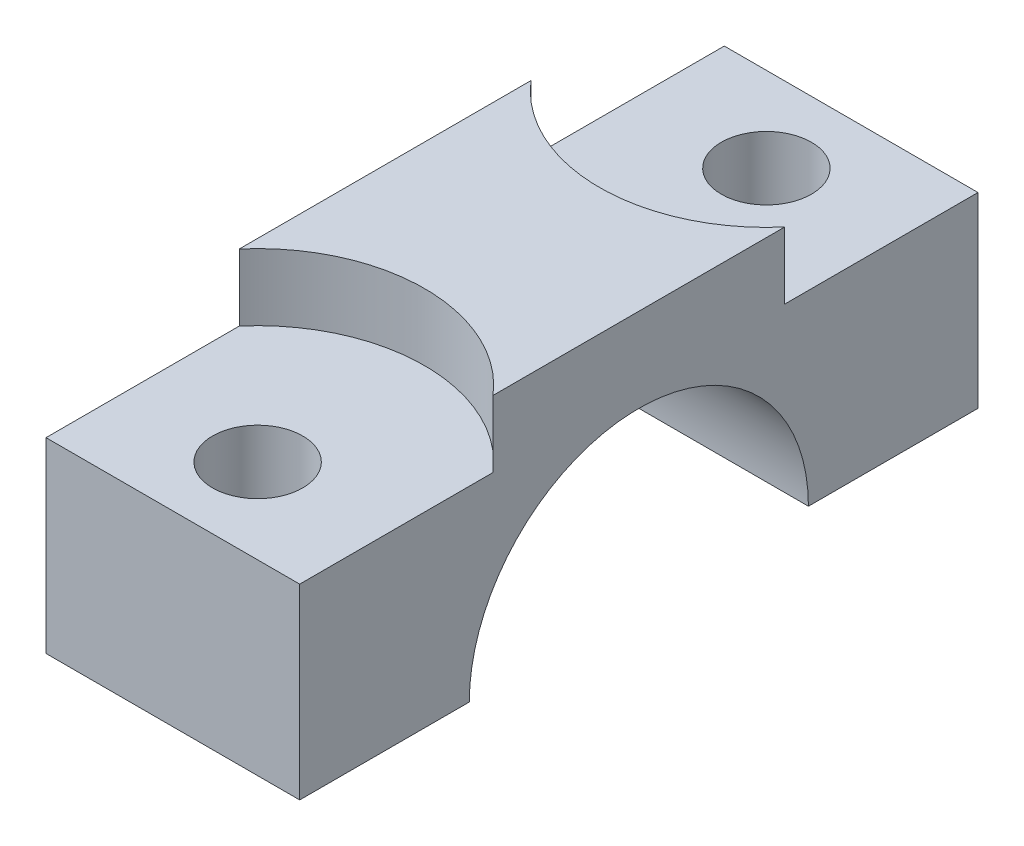
ISO-10303-21;
HEADER;
FILE_DESCRIPTION(('STEP AP214'),'2;1');
FILE_NAME('part.step','',(''),(''),'','','');
FILE_SCHEMA(('AUTOMOTIVE_DESIGN { 1 0 10303 214 1 1 1 1 }'));
ENDSEC;
DATA;
#1=APPLICATION_CONTEXT('core data for automotive mechanical design processes');
#2=APPLICATION_PROTOCOL_DEFINITION('international standard','automotive_design',2000,#1);
#3=PRODUCT_CONTEXT('',#1,'mechanical');
#4=PRODUCT('Part','Part','',(#3));
#5=PRODUCT_RELATED_PRODUCT_CATEGORY('part','',(#4));
#6=PRODUCT_DEFINITION_FORMATION('','',#4);
#7=PRODUCT_DEFINITION_CONTEXT('part definition',#1,'design');
#8=PRODUCT_DEFINITION('design','',#6,#7);
#9=PRODUCT_DEFINITION_SHAPE('','',#8);
#10=(LENGTH_UNIT() NAMED_UNIT(*) SI_UNIT(.MILLI.,.METRE.));
#11=(NAMED_UNIT(*) PLANE_ANGLE_UNIT() SI_UNIT($,.RADIAN.));
#12=(NAMED_UNIT(*) SI_UNIT($,.STERADIAN.) SOLID_ANGLE_UNIT());
#13=UNCERTAINTY_MEASURE_WITH_UNIT(LENGTH_MEASURE(1.E-05),#10,'distance_accuracy_value','');
#14=(GEOMETRIC_REPRESENTATION_CONTEXT(3) GLOBAL_UNCERTAINTY_ASSIGNED_CONTEXT((#13)) GLOBAL_UNIT_ASSIGNED_CONTEXT((#10,
#11,#12)) REPRESENTATION_CONTEXT('',''));
#15=CARTESIAN_POINT('',(0.,0.,0.));
#16=DIRECTION('',(0.,0.,1.));
#17=DIRECTION('',(1.,0.,0.));
#18=AXIS2_PLACEMENT_3D('',#15,#16,#17);
#19=CARTESIAN_POINT('',(9.5,0.,0.));
#20=DIRECTION('',(-1.,0.,0.));
#21=DIRECTION('',(0.,0.,1.));
#22=AXIS2_PLACEMENT_3D('',#19,#20,#21);
#23=CYLINDRICAL_SURFACE('',#22,12.7);
#24=CARTESIAN_POINT('',(-9.5,0.,0.));
#25=DIRECTION('',(1.,0.,0.));
#26=DIRECTION('',(0.,0.,-1.));
#27=AXIS2_PLACEMENT_3D('',#24,#25,#26);
#28=CIRCLE('',#27,12.7);
#29=CARTESIAN_POINT('',(-9.5,0.,-12.7));
#30=VERTEX_POINT('',#29);
#31=CARTESIAN_POINT('',(-9.5,0.,12.7));
#32=VERTEX_POINT('',#31);
#33=EDGE_CURVE('E144',#30,#32,#28,.T.);
#34=ORIENTED_EDGE('',*,*,#33,.F.);
#35=DIRECTION('',(-1.,0.,0.));
#36=VECTOR('',#35,1.);
#37=CARTESIAN_POINT('',(9.5,0.,-12.7));
#38=LINE('',#37,#36);
#39=CARTESIAN_POINT('',(9.5,0.,-12.7));
#40=VERTEX_POINT('',#39);
#41=EDGE_CURVE('E166',#40,#30,#38,.T.);
#42=ORIENTED_EDGE('',*,*,#41,.F.);
#43=CARTESIAN_POINT('',(9.5,0.,0.));
#44=DIRECTION('',(1.,0.,0.));
#45=DIRECTION('',(0.,0.,-1.));
#46=AXIS2_PLACEMENT_3D('',#43,#44,#45);
#47=CIRCLE('',#46,12.7);
#48=CARTESIAN_POINT('',(9.5,0.,12.7));
#49=VERTEX_POINT('',#48);
#50=EDGE_CURVE('E202',#40,#49,#47,.T.);
#51=ORIENTED_EDGE('',*,*,#50,.T.);
#52=DIRECTION('',(-1.,0.,0.));
#53=VECTOR('',#52,1.);
#54=CARTESIAN_POINT('',(9.5,0.,12.7));
#55=LINE('',#54,#53);
#56=EDGE_CURVE('E158',#49,#32,#55,.T.);
#57=ORIENTED_EDGE('',*,*,#56,.T.);
#58=EDGE_LOOP('',(#34,#42,#51,#57));
#59=FACE_BOUND('',#58,.T.);
#60=ADVANCED_FACE('F40',(#59),#23,.F.);
#61=CARTESIAN_POINT('',(9.5,0.,0.));
#62=DIRECTION('',(0.,1.,0.));
#63=DIRECTION('',(0.,0.,1.));
#64=AXIS2_PLACEMENT_3D('',#61,#62,#63);
#65=PLANE('',#64);
#66=CARTESIAN_POINT('',(0.,0.,-19.05));
#67=DIRECTION('',(0.,1.,0.));
#68=DIRECTION('',(0.,0.,1.));
#69=AXIS2_PLACEMENT_3D('',#66,#67,#68);
#70=CIRCLE('',#69,3.375);
#71=CARTESIAN_POINT('',(0.,0.,-15.675));
#72=VERTEX_POINT('',#71);
#73=EDGE_CURVE('E224',#72,#72,#70,.T.);
#74=ORIENTED_EDGE('',*,*,#73,.T.);
#75=EDGE_LOOP('',(#74));
#76=FACE_BOUND('',#75,.T.);
#77=DIRECTION('',(0.,0.,-1.));
#78=VECTOR('',#77,1.);
#79=CARTESIAN_POINT('',(-9.5,0.,0.));
#80=LINE('',#79,#78);
#81=CARTESIAN_POINT('',(-9.5,0.,-25.4));
#82=VERTEX_POINT('',#81);
#83=EDGE_CURVE('E147',#30,#82,#80,.T.);
#84=ORIENTED_EDGE('',*,*,#83,.T.);
#85=DIRECTION('',(-1.,0.,0.));
#86=VECTOR('',#85,1.);
#87=CARTESIAN_POINT('',(9.5,0.,-25.4));
#88=LINE('',#87,#86);
#89=CARTESIAN_POINT('',(9.5,0.,-25.4));
#90=VERTEX_POINT('',#89);
#91=EDGE_CURVE('E163',#90,#82,#88,.T.);
#92=ORIENTED_EDGE('',*,*,#91,.F.);
#93=DIRECTION('',(0.,0.,-1.));
#94=VECTOR('',#93,1.);
#95=CARTESIAN_POINT('',(9.5,0.,0.));
#96=LINE('',#95,#94);
#97=EDGE_CURVE('E140',#40,#90,#96,.T.);
#98=ORIENTED_EDGE('',*,*,#97,.F.);
#99=ORIENTED_EDGE('',*,*,#41,.T.);
#100=EDGE_LOOP('',(#84,#92,#98,#99));
#101=FACE_BOUND('',#100,.T.);
#102=ADVANCED_FACE('F220',(#76,#101),#65,.F.);
#103=CARTESIAN_POINT('',(9.5,0.,-25.4));
#104=DIRECTION('',(0.,0.,-1.));
#105=DIRECTION('',(-1.,0.,0.));
#106=AXIS2_PLACEMENT_3D('',#103,#104,#105);
#107=PLANE('',#106);
#108=DIRECTION('',(-1.,0.,0.));
#109=VECTOR('',#108,1.);
#110=CARTESIAN_POINT('',(9.5,14.,-25.4));
#111=LINE('',#110,#109);
#112=CARTESIAN_POINT('',(9.5,14.,-25.4));
#113=VERTEX_POINT('',#112);
#114=CARTESIAN_POINT('',(-9.5,14.,-25.4));
#115=VERTEX_POINT('',#114);
#116=EDGE_CURVE('E193',#113,#115,#111,.T.);
#117=ORIENTED_EDGE('',*,*,#116,.F.);
#118=DIRECTION('',(0.,-1.,0.));
#119=VECTOR('',#118,1.);
#120=CARTESIAN_POINT('',(9.5,0.,-25.4));
#121=LINE('',#120,#119);
#122=EDGE_CURVE('E136',#113,#90,#121,.T.);
#123=ORIENTED_EDGE('',*,*,#122,.T.);
#124=ORIENTED_EDGE('',*,*,#91,.T.);
#125=DIRECTION('',(0.,-1.,0.));
#126=VECTOR('',#125,1.);
#127=CARTESIAN_POINT('',(-9.5,0.,-25.4));
#128=LINE('',#127,#126);
#129=EDGE_CURVE('E151',#115,#82,#128,.T.);
#130=ORIENTED_EDGE('',*,*,#129,.F.);
#131=EDGE_LOOP('',(#117,#123,#124,#130));
#132=FACE_BOUND('',#131,.T.);
#133=ADVANCED_FACE('F223',(#132),#107,.T.);
#134=CARTESIAN_POINT('',(9.5,19.,0.));
#135=DIRECTION('',(0.,1.,0.));
#136=DIRECTION('',(0.,0.,1.));
#137=AXIS2_PLACEMENT_3D('',#134,#135,#136);
#138=PLANE('',#137);
#139=CARTESIAN_POINT('',(0.,19.,-19.05));
#140=DIRECTION('',(0.,1.,0.));
#141=DIRECTION('',(0.,0.,1.));
#142=AXIS2_PLACEMENT_3D('',#139,#140,#141);
#143=CIRCLE('',#142,12.5);
#144=CARTESIAN_POINT('',(-9.5,19.,-10.925961595364));
#145=VERTEX_POINT('',#144);
#146=CARTESIAN_POINT('',(9.5,19.,-10.925961595364));
#147=VERTEX_POINT('',#146);
#148=EDGE_CURVE('E115',#145,#147,#143,.T.);
#149=ORIENTED_EDGE('',*,*,#148,.F.);
#150=DIRECTION('',(0.,0.,-1.));
#151=VECTOR('',#150,1.);
#152=CARTESIAN_POINT('',(-9.5,19.,0.));
#153=LINE('',#152,#151);
#154=CARTESIAN_POINT('',(-9.5,19.,10.925961595364));
#155=VERTEX_POINT('',#154);
#156=EDGE_CURVE('E154',#155,#145,#153,.T.);
#157=ORIENTED_EDGE('',*,*,#156,.F.);
#158=CARTESIAN_POINT('',(0.,19.,19.05));
#159=DIRECTION('',(0.,1.,0.));
#160=DIRECTION('',(0.,0.,1.));
#161=AXIS2_PLACEMENT_3D('',#158,#159,#160);
#162=CIRCLE('',#161,12.5);
#163=CARTESIAN_POINT('',(9.5,19.,10.925961595364));
#164=VERTEX_POINT('',#163);
#165=EDGE_CURVE('E62',#164,#155,#162,.T.);
#166=ORIENTED_EDGE('',*,*,#165,.F.);
#167=DIRECTION('',(0.,0.,-1.));
#168=VECTOR('',#167,1.);
#169=CARTESIAN_POINT('',(9.5,19.,0.));
#170=LINE('',#169,#168);
#171=EDGE_CURVE('E130',#164,#147,#170,.T.);
#172=ORIENTED_EDGE('',*,*,#171,.T.);
#173=EDGE_LOOP('',(#149,#157,#166,#172));
#174=FACE_BOUND('',#173,.T.);
#175=ADVANCED_FACE('F134',(#174),#138,.T.);
#176=CARTESIAN_POINT('',(9.5,0.,25.4));
#177=DIRECTION('',(0.,0.,-1.));
#178=DIRECTION('',(-1.,0.,0.));
#179=AXIS2_PLACEMENT_3D('',#176,#177,#178);
#180=PLANE('',#179);
#181=DIRECTION('',(0.,-1.,0.));
#182=VECTOR('',#181,1.);
#183=CARTESIAN_POINT('',(9.5,0.,25.4));
#184=LINE('',#183,#182);
#185=CARTESIAN_POINT('',(9.5,14.,25.4));
#186=VERTEX_POINT('',#185);
#187=CARTESIAN_POINT('',(9.5,0.,25.4));
#188=VERTEX_POINT('',#187);
#189=EDGE_CURVE('E135',#186,#188,#184,.T.);
#190=ORIENTED_EDGE('',*,*,#189,.F.);
#191=DIRECTION('',(-1.,0.,0.));
#192=VECTOR('',#191,1.);
#193=CARTESIAN_POINT('',(9.5,14.,25.4));
#194=LINE('',#193,#192);
#195=CARTESIAN_POINT('',(-9.5,14.,25.4));
#196=VERTEX_POINT('',#195);
#197=EDGE_CURVE('E148',#186,#196,#194,.T.);
#198=ORIENTED_EDGE('',*,*,#197,.T.);
#199=DIRECTION('',(0.,-1.,0.));
#200=VECTOR('',#199,1.);
#201=CARTESIAN_POINT('',(-9.5,0.,25.4));
#202=LINE('',#201,#200);
#203=CARTESIAN_POINT('',(-9.5,0.,25.4));
#204=VERTEX_POINT('',#203);
#205=EDGE_CURVE('E156',#196,#204,#202,.T.);
#206=ORIENTED_EDGE('',*,*,#205,.T.);
#207=DIRECTION('',(-1.,0.,0.));
#208=VECTOR('',#207,1.);
#209=CARTESIAN_POINT('',(9.5,0.,25.4));
#210=LINE('',#209,#208);
#211=EDGE_CURVE('E160',#188,#204,#210,.T.);
#212=ORIENTED_EDGE('',*,*,#211,.F.);
#213=EDGE_LOOP('',(#190,#198,#206,#212));
#214=FACE_BOUND('',#213,.T.);
#215=ADVANCED_FACE('F257',(#214),#180,.F.);
#216=CARTESIAN_POINT('',(0.,0.,19.05));
#217=DIRECTION('',(0.,1.,0.));
#218=DIRECTION('',(0.,0.,1.));
#219=AXIS2_PLACEMENT_3D('',#216,#217,#218);
#220=CIRCLE('',#219,3.375);
#221=CARTESIAN_POINT('',(0.,0.,22.425));
#222=VERTEX_POINT('',#221);
#223=EDGE_CURVE('E191',#222,#222,#220,.T.);
#224=ORIENTED_EDGE('',*,*,#223,.T.);
#225=EDGE_LOOP('',(#224));
#226=FACE_BOUND('',#225,.T.);
#227=EDGE_CURVE('E152',#204,#32,#80,.T.);
#228=ORIENTED_EDGE('',*,*,#227,.T.);
#229=ORIENTED_EDGE('',*,*,#56,.F.);
#230=EDGE_CURVE('E138',#188,#49,#96,.T.);
#231=ORIENTED_EDGE('',*,*,#230,.F.);
#232=ORIENTED_EDGE('',*,*,#211,.T.);
#233=EDGE_LOOP('',(#228,#229,#231,#232));
#234=FACE_BOUND('',#233,.T.);
#235=ADVANCED_FACE('F214',(#226,#234),#65,.F.);
#236=CARTESIAN_POINT('',(9.5,0.,0.));
#237=DIRECTION('',(1.,0.,0.));
#238=DIRECTION('',(0.,0.,-1.));
#239=AXIS2_PLACEMENT_3D('',#236,#237,#238);
#240=PLANE('',#239);
#241=DIRECTION('',(0.,1.,0.));
#242=VECTOR('',#241,1.);
#243=CARTESIAN_POINT('',(9.5,19.,-10.925961595364));
#244=LINE('',#243,#242);
#245=CARTESIAN_POINT('',(9.5,14.,-10.925961595364));
#246=VERTEX_POINT('',#245);
#247=EDGE_CURVE('E118',#147,#246,#244,.F.);
#248=ORIENTED_EDGE('',*,*,#247,.F.);
#249=ORIENTED_EDGE('',*,*,#171,.F.);
#250=DIRECTION('',(0.,1.,0.));
#251=VECTOR('',#250,1.);
#252=CARTESIAN_POINT('',(9.5,19.,10.925961595364));
#253=LINE('',#252,#251);
#254=CARTESIAN_POINT('',(9.5,14.,10.925961595364));
#255=VERTEX_POINT('',#254);
#256=EDGE_CURVE('E199',#255,#164,#253,.T.);
#257=ORIENTED_EDGE('',*,*,#256,.F.);
#258=DIRECTION('',(0.,0.,-1.));
#259=VECTOR('',#258,1.);
#260=CARTESIAN_POINT('',(9.5,14.,0.));
#261=LINE('',#260,#259);
#262=EDGE_CURVE('E173',#186,#255,#261,.T.);
#263=ORIENTED_EDGE('',*,*,#262,.F.);
#264=ORIENTED_EDGE('',*,*,#189,.T.);
#265=ORIENTED_EDGE('',*,*,#230,.T.);
#266=ORIENTED_EDGE('',*,*,#50,.F.);
#267=ORIENTED_EDGE('',*,*,#97,.T.);
#268=ORIENTED_EDGE('',*,*,#122,.F.);
#269=DIRECTION('',(0.,0.,-1.));
#270=VECTOR('',#269,1.);
#271=CARTESIAN_POINT('',(9.5,14.,0.));
#272=LINE('',#271,#270);
#273=EDGE_CURVE('E132',#246,#113,#272,.T.);
#274=ORIENTED_EDGE('',*,*,#273,.F.);
#275=EDGE_LOOP('',(#248,#249,#257,#263,#264,#265,#266,#267,#268,#274));
#276=FACE_BOUND('',#275,.T.);
#277=ADVANCED_FACE('F128',(#276),#240,.T.);
#278=CARTESIAN_POINT('',(-9.5,0.,0.));
#279=DIRECTION('',(1.,0.,0.));
#280=DIRECTION('',(0.,0.,-1.));
#281=AXIS2_PLACEMENT_3D('',#278,#279,#280);
#282=PLANE('',#281);
#283=DIRECTION('',(0.,1.,0.));
#284=VECTOR('',#283,1.);
#285=CARTESIAN_POINT('',(-9.5,19.,-10.925961595364));
#286=LINE('',#285,#284);
#287=CARTESIAN_POINT('',(-9.5,14.,-10.925961595364));
#288=VERTEX_POINT('',#287);
#289=EDGE_CURVE('E47',#145,#288,#286,.F.);
#290=ORIENTED_EDGE('',*,*,#289,.T.);
#291=DIRECTION('',(0.,0.,-1.));
#292=VECTOR('',#291,1.);
#293=CARTESIAN_POINT('',(-9.5,14.,0.));
#294=LINE('',#293,#292);
#295=EDGE_CURVE('E11',#288,#115,#294,.T.);
#296=ORIENTED_EDGE('',*,*,#295,.T.);
#297=ORIENTED_EDGE('',*,*,#129,.T.);
#298=ORIENTED_EDGE('',*,*,#83,.F.);
#299=ORIENTED_EDGE('',*,*,#33,.T.);
#300=ORIENTED_EDGE('',*,*,#227,.F.);
#301=ORIENTED_EDGE('',*,*,#205,.F.);
#302=DIRECTION('',(0.,0.,-1.));
#303=VECTOR('',#302,1.);
#304=CARTESIAN_POINT('',(-9.5,14.,0.));
#305=LINE('',#304,#303);
#306=CARTESIAN_POINT('',(-9.5,14.,10.925961595364));
#307=VERTEX_POINT('',#306);
#308=EDGE_CURVE('E170',#196,#307,#305,.T.);
#309=ORIENTED_EDGE('',*,*,#308,.T.);
#310=DIRECTION('',(0.,1.,0.));
#311=VECTOR('',#310,1.);
#312=CARTESIAN_POINT('',(-9.5,19.,10.925961595364));
#313=LINE('',#312,#311);
#314=EDGE_CURVE('E168',#307,#155,#313,.T.);
#315=ORIENTED_EDGE('',*,*,#314,.T.);
#316=ORIENTED_EDGE('',*,*,#156,.T.);
#317=EDGE_LOOP('',(#290,#296,#297,#298,#299,#300,#301,#309,#315,#316));
#318=FACE_BOUND('',#317,.T.);
#319=ADVANCED_FACE('F176',(#318),#282,.F.);
#320=CARTESIAN_POINT('',(0.,19.,19.05));
#321=DIRECTION('',(0.,1.,0.));
#322=DIRECTION('',(0.,0.,1.));
#323=AXIS2_PLACEMENT_3D('',#320,#321,#322);
#324=CYLINDRICAL_SURFACE('',#323,3.375);
#325=ORIENTED_EDGE('',*,*,#223,.F.);
#326=EDGE_LOOP('',(#325));
#327=FACE_BOUND('',#326,.T.);
#328=CARTESIAN_POINT('',(0.,14.,19.05));
#329=DIRECTION('',(0.,1.,0.));
#330=DIRECTION('',(0.,0.,1.));
#331=AXIS2_PLACEMENT_3D('',#328,#329,#330);
#332=CIRCLE('',#331,3.375);
#333=CARTESIAN_POINT('',(0.,14.,22.425));
#334=VERTEX_POINT('',#333);
#335=EDGE_CURVE('E188',#334,#334,#332,.T.);
#336=ORIENTED_EDGE('',*,*,#335,.T.);
#337=EDGE_LOOP('',(#336));
#338=FACE_BOUND('',#337,.T.);
#339=ADVANCED_FACE('F267',(#327,#338),#324,.F.);
#340=CARTESIAN_POINT('',(3.375,14.,19.05));
#341=DIRECTION('',(0.,-1.,0.));
#342=DIRECTION('',(0.,0.,-1.));
#343=AXIS2_PLACEMENT_3D('',#340,#341,#342);
#344=PLANE('',#343);
#345=ORIENTED_EDGE('',*,*,#262,.T.);
#346=CARTESIAN_POINT('',(0.,14.,19.05));
#347=DIRECTION('',(0.,1.,0.));
#348=DIRECTION('',(0.,0.,1.));
#349=AXIS2_PLACEMENT_3D('',#346,#347,#348);
#350=CIRCLE('',#349,12.5);
#351=EDGE_CURVE('E182',#255,#307,#350,.T.);
#352=ORIENTED_EDGE('',*,*,#351,.T.);
#353=ORIENTED_EDGE('',*,*,#308,.F.);
#354=ORIENTED_EDGE('',*,*,#197,.F.);
#355=EDGE_LOOP('',(#345,#352,#353,#354));
#356=FACE_BOUND('',#355,.T.);
#357=ORIENTED_EDGE('',*,*,#335,.F.);
#358=EDGE_LOOP('',(#357));
#359=FACE_BOUND('',#358,.T.);
#360=ADVANCED_FACE('F184',(#356,#359),#344,.F.);
#361=CARTESIAN_POINT('',(0.,19.,19.05));
#362=DIRECTION('',(0.,1.,0.));
#363=DIRECTION('',(0.,0.,1.));
#364=AXIS2_PLACEMENT_3D('',#361,#362,#363);
#365=CYLINDRICAL_SURFACE('',#364,12.5);
#366=ORIENTED_EDGE('',*,*,#256,.T.);
#367=ORIENTED_EDGE('',*,*,#165,.T.);
#368=ORIENTED_EDGE('',*,*,#314,.F.);
#369=ORIENTED_EDGE('',*,*,#351,.F.);
#370=EDGE_LOOP('',(#366,#367,#368,#369));
#371=FACE_BOUND('',#370,.T.);
#372=ADVANCED_FACE('F181',(#371),#365,.F.);
#373=CARTESIAN_POINT('',(0.,19.,-19.05));
#374=DIRECTION('',(0.,1.,0.));
#375=DIRECTION('',(0.,0.,1.));
#376=AXIS2_PLACEMENT_3D('',#373,#374,#375);
#377=CYLINDRICAL_SURFACE('',#376,12.5);
#378=ORIENTED_EDGE('',*,*,#148,.T.);
#379=ORIENTED_EDGE('',*,*,#247,.T.);
#380=CARTESIAN_POINT('',(0.,14.,-19.05));
#381=DIRECTION('',(0.,1.,0.));
#382=DIRECTION('',(0.,0.,1.));
#383=AXIS2_PLACEMENT_3D('',#380,#381,#382);
#384=CIRCLE('',#383,12.5);
#385=EDGE_CURVE('E54',#288,#246,#384,.T.);
#386=ORIENTED_EDGE('',*,*,#385,.F.);
#387=ORIENTED_EDGE('',*,*,#289,.F.);
#388=EDGE_LOOP('',(#378,#379,#386,#387));
#389=FACE_BOUND('',#388,.T.);
#390=ADVANCED_FACE('F117',(#389),#377,.F.);
#391=CARTESIAN_POINT('',(3.375,14.,-19.05));
#392=DIRECTION('',(0.,-1.,0.));
#393=DIRECTION('',(0.,0.,-1.));
#394=AXIS2_PLACEMENT_3D('',#391,#392,#393);
#395=PLANE('',#394);
#396=CARTESIAN_POINT('',(0.,14.,-19.05));
#397=DIRECTION('',(0.,1.,0.));
#398=DIRECTION('',(0.,0.,1.));
#399=AXIS2_PLACEMENT_3D('',#396,#397,#398);
#400=CIRCLE('',#399,3.375);
#401=CARTESIAN_POINT('',(0.,14.,-15.675));
#402=VERTEX_POINT('',#401);
#403=EDGE_CURVE('E226',#402,#402,#400,.T.);
#404=ORIENTED_EDGE('',*,*,#403,.F.);
#405=EDGE_LOOP('',(#404));
#406=FACE_BOUND('',#405,.T.);
#407=ORIENTED_EDGE('',*,*,#385,.T.);
#408=ORIENTED_EDGE('',*,*,#273,.T.);
#409=ORIENTED_EDGE('',*,*,#116,.T.);
#410=ORIENTED_EDGE('',*,*,#295,.F.);
#411=EDGE_LOOP('',(#407,#408,#409,#410));
#412=FACE_BOUND('',#411,.T.);
#413=ADVANCED_FACE('F235',(#406,#412),#395,.F.);
#414=CARTESIAN_POINT('',(0.,19.,-19.05));
#415=DIRECTION('',(0.,1.,0.));
#416=DIRECTION('',(0.,0.,1.));
#417=AXIS2_PLACEMENT_3D('',#414,#415,#416);
#418=CYLINDRICAL_SURFACE('',#417,3.375);
#419=ORIENTED_EDGE('',*,*,#73,.F.);
#420=EDGE_LOOP('',(#419));
#421=FACE_BOUND('',#420,.T.);
#422=ORIENTED_EDGE('',*,*,#403,.T.);
#423=EDGE_LOOP('',(#422));
#424=FACE_BOUND('',#423,.T.);
#425=ADVANCED_FACE('F233',(#421,#424),#418,.F.);
#426=CLOSED_SHELL('',(#60,#102,#133,#175,#215,#235,#277,#319,#339,#360,#372,#390,#413,#425));
#427=MANIFOLD_SOLID_BREP('B2',#426);
#428=ADVANCED_BREP_SHAPE_REPRESENTATION('',(#18,#427),#14);
#429=SHAPE_DEFINITION_REPRESENTATION(#9,#428);
ENDSEC;
END-ISO-10303-21;
